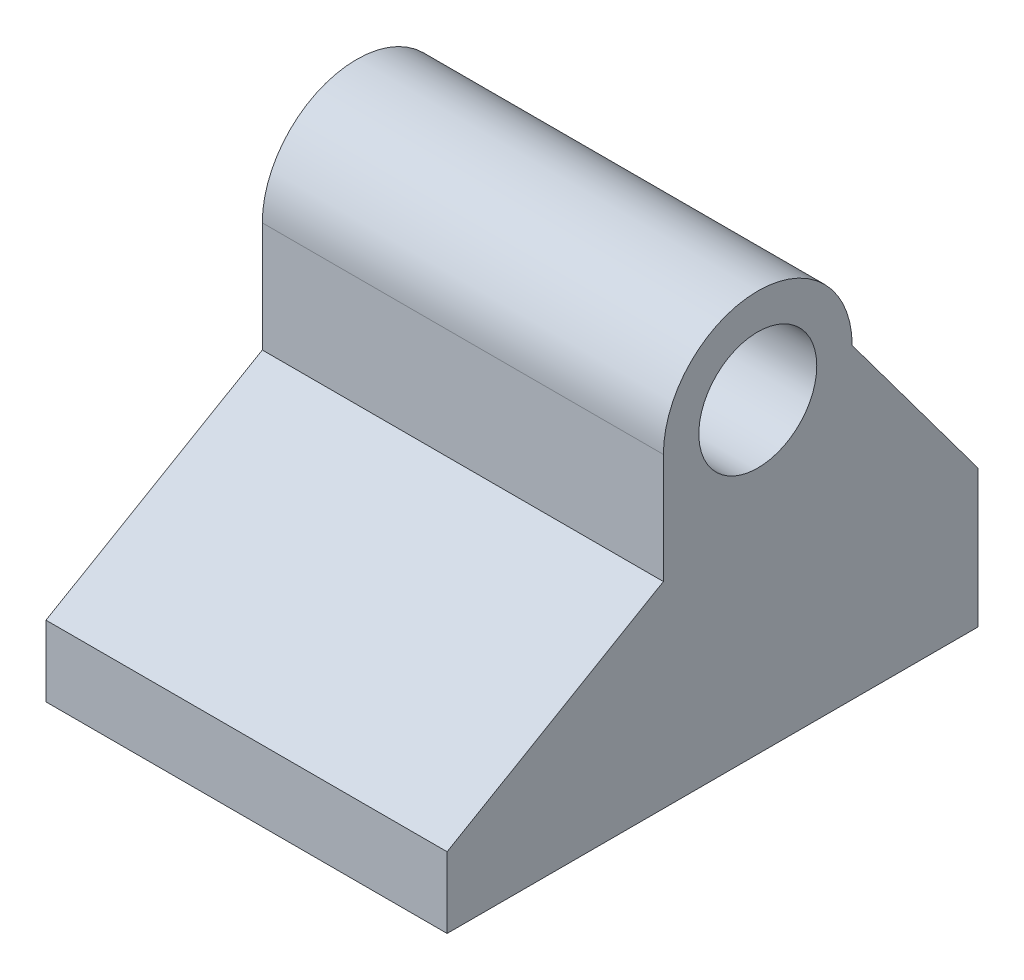
ISO-10303-21;
HEADER;
FILE_DESCRIPTION(('STEP AP214'),'2;1');
FILE_NAME('part.step','',(''),(''),'','','');
FILE_SCHEMA(('AUTOMOTIVE_DESIGN { 1 0 10303 214 1 1 1 1 }'));
ENDSEC;
DATA;
#1=APPLICATION_CONTEXT('core data for automotive mechanical design processes');
#2=APPLICATION_PROTOCOL_DEFINITION('international standard','automotive_design',2000,#1);
#3=PRODUCT_CONTEXT('',#1,'mechanical');
#4=PRODUCT('Part','Part','',(#3));
#5=PRODUCT_RELATED_PRODUCT_CATEGORY('part','',(#4));
#6=PRODUCT_DEFINITION_FORMATION('','',#4);
#7=PRODUCT_DEFINITION_CONTEXT('part definition',#1,'design');
#8=PRODUCT_DEFINITION('design','',#6,#7);
#9=PRODUCT_DEFINITION_SHAPE('','',#8);
#10=(LENGTH_UNIT() NAMED_UNIT(*) SI_UNIT(.MILLI.,.METRE.));
#11=(NAMED_UNIT(*) PLANE_ANGLE_UNIT() SI_UNIT($,.RADIAN.));
#12=(NAMED_UNIT(*) SI_UNIT($,.STERADIAN.) SOLID_ANGLE_UNIT());
#13=UNCERTAINTY_MEASURE_WITH_UNIT(LENGTH_MEASURE(1.E-05),#10,'distance_accuracy_value','');
#14=(GEOMETRIC_REPRESENTATION_CONTEXT(3) GLOBAL_UNCERTAINTY_ASSIGNED_CONTEXT((#13)) GLOBAL_UNIT_ASSIGNED_CONTEXT((#10,
#11,#12)) REPRESENTATION_CONTEXT('',''));
#15=CARTESIAN_POINT('',(0.,0.,0.));
#16=DIRECTION('',(0.,0.,1.));
#17=DIRECTION('',(1.,0.,0.));
#18=AXIS2_PLACEMENT_3D('',#15,#16,#17);
#19=CARTESIAN_POINT('',(102.633192204752,78.,56.));
#20=DIRECTION('',(-1.,0.,0.));
#21=DIRECTION('',(0.,0.,1.));
#22=AXIS2_PLACEMENT_3D('',#19,#20,#21);
#23=PLANE('',#22);
#24=DIRECTION('',(0.,0.,-1.));
#25=VECTOR('',#24,1.);
#26=CARTESIAN_POINT('',(102.633192204752,0.,0.));
#27=LINE('',#26,#25);
#28=CARTESIAN_POINT('',(102.633192204752,0.,135.));
#29=VERTEX_POINT('',#28);
#30=CARTESIAN_POINT('',(102.633192204752,0.,0.));
#31=VERTEX_POINT('',#30);
#32=EDGE_CURVE('E141',#29,#31,#27,.T.);
#33=ORIENTED_EDGE('',*,*,#32,.T.);
#34=DIRECTION('',(0.,1.,0.));
#35=VECTOR('',#34,1.);
#36=CARTESIAN_POINT('',(102.633192204752,0.,0.));
#37=LINE('',#36,#35);
#38=CARTESIAN_POINT('',(102.633192204752,35.,0.));
#39=VERTEX_POINT('',#38);
#40=EDGE_CURVE('E94',#31,#39,#37,.T.);
#41=ORIENTED_EDGE('',*,*,#40,.T.);
#42=DIRECTION('',(0.,0.802233221274024,0.597010769320204));
#43=VECTOR('',#42,1.);
#44=CARTESIAN_POINT('',(102.633192204752,35.,0.));
#45=LINE('',#44,#43);
#46=CARTESIAN_POINT('',(102.633192204752,78.,32.));
#47=VERTEX_POINT('',#46);
#48=EDGE_CURVE('E153',#39,#47,#45,.T.);
#49=ORIENTED_EDGE('',*,*,#48,.T.);
#50=CARTESIAN_POINT('',(102.633192204752,78.,56.));
#51=DIRECTION('',(1.,0.,0.));
#52=DIRECTION('',(0.,0.,1.));
#53=AXIS2_PLACEMENT_3D('',#50,#51,#52);
#54=CIRCLE('',#53,24.);
#55=CARTESIAN_POINT('',(102.633192204752,78.,80.));
#56=VERTEX_POINT('',#55);
#57=EDGE_CURVE('E110',#47,#56,#54,.T.);
#58=ORIENTED_EDGE('',*,*,#57,.T.);
#59=DIRECTION('',(0.,-1.,0.));
#60=VECTOR('',#59,1.);
#61=CARTESIAN_POINT('',(102.633192204752,50.,80.));
#62=LINE('',#61,#60);
#63=CARTESIAN_POINT('',(102.633192204752,50.,80.));
#64=VERTEX_POINT('',#63);
#65=EDGE_CURVE('E104',#56,#64,#62,.T.);
#66=ORIENTED_EDGE('',*,*,#65,.T.);
#67=DIRECTION('',(0.,-0.502893578303638,0.864348337709377));
#68=VECTOR('',#67,1.);
#69=CARTESIAN_POINT('',(102.633192204752,18.,135.));
#70=LINE('',#69,#68);
#71=CARTESIAN_POINT('',(102.633192204752,18.,135.));
#72=VERTEX_POINT('',#71);
#73=EDGE_CURVE('E108',#64,#72,#70,.T.);
#74=ORIENTED_EDGE('',*,*,#73,.T.);
#75=DIRECTION('',(0.,-1.,0.));
#76=VECTOR('',#75,1.);
#77=CARTESIAN_POINT('',(102.633192204752,0.,135.));
#78=LINE('',#77,#76);
#79=EDGE_CURVE('E54',#72,#29,#78,.T.);
#80=ORIENTED_EDGE('',*,*,#79,.T.);
#81=EDGE_LOOP('',(#33,#41,#49,#58,#66,#74,#80));
#82=FACE_BOUND('',#81,.T.);
#83=CARTESIAN_POINT('',(102.633192204752,78.,56.));
#84=DIRECTION('',(1.,0.,0.));
#85=DIRECTION('',(0.,0.,-1.));
#86=AXIS2_PLACEMENT_3D('',#83,#84,#85);
#87=CIRCLE('',#86,15.);
#88=CARTESIAN_POINT('',(102.633192204752,78.,41.));
#89=VERTEX_POINT('',#88);
#90=EDGE_CURVE('E132',#89,#89,#87,.T.);
#91=ORIENTED_EDGE('',*,*,#90,.F.);
#92=EDGE_LOOP('',(#91));
#93=FACE_BOUND('',#92,.T.);
#94=ADVANCED_FACE('F37',(#82,#93),#23,.F.);
#95=CARTESIAN_POINT('',(0.633192204751778,78.,56.));
#96=DIRECTION('',(-1.,0.,0.));
#97=DIRECTION('',(0.,0.,1.));
#98=AXIS2_PLACEMENT_3D('',#95,#96,#97);
#99=PLANE('',#98);
#100=DIRECTION('',(0.,0.,-1.));
#101=VECTOR('',#100,1.);
#102=CARTESIAN_POINT('',(0.633192204751778,0.,0.));
#103=LINE('',#102,#101);
#104=CARTESIAN_POINT('',(0.633192204751778,0.,135.));
#105=VERTEX_POINT('',#104);
#106=CARTESIAN_POINT('',(0.633192204751778,0.,0.));
#107=VERTEX_POINT('',#106);
#108=EDGE_CURVE('E128',#105,#107,#103,.T.);
#109=ORIENTED_EDGE('',*,*,#108,.F.);
#110=DIRECTION('',(0.,-1.,0.));
#111=VECTOR('',#110,1.);
#112=CARTESIAN_POINT('',(0.633192204751778,0.,135.));
#113=LINE('',#112,#111);
#114=CARTESIAN_POINT('',(0.633192204751778,18.,135.));
#115=VERTEX_POINT('',#114);
#116=EDGE_CURVE('E86',#115,#105,#113,.T.);
#117=ORIENTED_EDGE('',*,*,#116,.F.);
#118=DIRECTION('',(0.,-0.502893578303638,0.864348337709377));
#119=VECTOR('',#118,1.);
#120=CARTESIAN_POINT('',(0.633192204751778,18.,135.));
#121=LINE('',#120,#119);
#122=CARTESIAN_POINT('',(0.633192204751778,50.,80.));
#123=VERTEX_POINT('',#122);
#124=EDGE_CURVE('E80',#123,#115,#121,.T.);
#125=ORIENTED_EDGE('',*,*,#124,.F.);
#126=DIRECTION('',(0.,-1.,0.));
#127=VECTOR('',#126,1.);
#128=CARTESIAN_POINT('',(0.633192204751778,50.,80.));
#129=LINE('',#128,#127);
#130=CARTESIAN_POINT('',(0.633192204751778,78.,80.));
#131=VERTEX_POINT('',#130);
#132=EDGE_CURVE('E118',#131,#123,#129,.T.);
#133=ORIENTED_EDGE('',*,*,#132,.F.);
#134=CARTESIAN_POINT('',(0.633192204751778,78.,56.));
#135=DIRECTION('',(1.,0.,0.));
#136=DIRECTION('',(0.,0.,1.));
#137=AXIS2_PLACEMENT_3D('',#134,#135,#136);
#138=CIRCLE('',#137,24.);
#139=CARTESIAN_POINT('',(0.633192204751778,78.,32.));
#140=VERTEX_POINT('',#139);
#141=EDGE_CURVE('E136',#140,#131,#138,.T.);
#142=ORIENTED_EDGE('',*,*,#141,.F.);
#143=DIRECTION('',(0.,0.802233221274024,0.597010769320204));
#144=VECTOR('',#143,1.);
#145=CARTESIAN_POINT('',(0.633192204751778,35.,0.));
#146=LINE('',#145,#144);
#147=CARTESIAN_POINT('',(0.633192204751778,35.,0.));
#148=VERTEX_POINT('',#147);
#149=EDGE_CURVE('E134',#148,#140,#146,.T.);
#150=ORIENTED_EDGE('',*,*,#149,.F.);
#151=DIRECTION('',(0.,1.,0.));
#152=VECTOR('',#151,1.);
#153=CARTESIAN_POINT('',(0.633192204751778,0.,0.));
#154=LINE('',#153,#152);
#155=EDGE_CURVE('E131',#107,#148,#154,.T.);
#156=ORIENTED_EDGE('',*,*,#155,.F.);
#157=EDGE_LOOP('',(#109,#117,#125,#133,#142,#150,#156));
#158=FACE_BOUND('',#157,.T.);
#159=CARTESIAN_POINT('',(0.633192204751778,78.,56.));
#160=DIRECTION('',(1.,0.,0.));
#161=DIRECTION('',(0.,0.,-1.));
#162=AXIS2_PLACEMENT_3D('',#159,#160,#161);
#163=CIRCLE('',#162,15.);
#164=CARTESIAN_POINT('',(0.633192204751778,78.,41.));
#165=VERTEX_POINT('',#164);
#166=EDGE_CURVE('E165',#165,#165,#163,.T.);
#167=ORIENTED_EDGE('',*,*,#166,.T.);
#168=EDGE_LOOP('',(#167));
#169=FACE_BOUND('',#168,.T.);
#170=ADVANCED_FACE('F157',(#158,#169),#99,.T.);
#171=CARTESIAN_POINT('',(102.633192204752,0.,0.));
#172=DIRECTION('',(0.,1.,0.));
#173=DIRECTION('',(0.,0.,1.));
#174=AXIS2_PLACEMENT_3D('',#171,#172,#173);
#175=PLANE('',#174);
#176=ORIENTED_EDGE('',*,*,#108,.T.);
#177=DIRECTION('',(-1.,0.,0.));
#178=VECTOR('',#177,1.);
#179=CARTESIAN_POINT('',(102.633192204752,0.,0.));
#180=LINE('',#179,#178);
#181=EDGE_CURVE('E11',#31,#107,#180,.T.);
#182=ORIENTED_EDGE('',*,*,#181,.F.);
#183=ORIENTED_EDGE('',*,*,#32,.F.);
#184=DIRECTION('',(-1.,0.,0.));
#185=VECTOR('',#184,1.);
#186=CARTESIAN_POINT('',(102.633192204752,0.,135.));
#187=LINE('',#186,#185);
#188=EDGE_CURVE('E124',#29,#105,#187,.T.);
#189=ORIENTED_EDGE('',*,*,#188,.T.);
#190=EDGE_LOOP('',(#176,#182,#183,#189));
#191=FACE_BOUND('',#190,.T.);
#192=ADVANCED_FACE('F39',(#191),#175,.F.);
#193=CARTESIAN_POINT('',(102.633192204752,0.,0.));
#194=DIRECTION('',(0.,0.,1.));
#195=DIRECTION('',(1.,0.,0.));
#196=AXIS2_PLACEMENT_3D('',#193,#194,#195);
#197=PLANE('',#196);
#198=ORIENTED_EDGE('',*,*,#155,.T.);
#199=DIRECTION('',(-1.,0.,0.));
#200=VECTOR('',#199,1.);
#201=CARTESIAN_POINT('',(102.633192204752,35.,0.));
#202=LINE('',#201,#200);
#203=EDGE_CURVE('E46',#39,#148,#202,.T.);
#204=ORIENTED_EDGE('',*,*,#203,.F.);
#205=ORIENTED_EDGE('',*,*,#40,.F.);
#206=ORIENTED_EDGE('',*,*,#181,.T.);
#207=EDGE_LOOP('',(#198,#204,#205,#206));
#208=FACE_BOUND('',#207,.T.);
#209=ADVANCED_FACE('F191',(#208),#197,.F.);
#210=CARTESIAN_POINT('',(102.633192204752,35.,0.));
#211=DIRECTION('',(0.,-0.597010769320205,0.802233221274024));
#212=DIRECTION('',(0.,-0.802233221274024,-0.597010769320205));
#213=AXIS2_PLACEMENT_3D('',#210,#211,#212);
#214=PLANE('',#213);
#215=ORIENTED_EDGE('',*,*,#149,.T.);
#216=DIRECTION('',(-1.,0.,0.));
#217=VECTOR('',#216,1.);
#218=CARTESIAN_POINT('',(102.633192204752,78.,32.));
#219=LINE('',#218,#217);
#220=EDGE_CURVE('E145',#47,#140,#219,.T.);
#221=ORIENTED_EDGE('',*,*,#220,.F.);
#222=ORIENTED_EDGE('',*,*,#48,.F.);
#223=ORIENTED_EDGE('',*,*,#203,.T.);
#224=EDGE_LOOP('',(#215,#221,#222,#223));
#225=FACE_BOUND('',#224,.T.);
#226=ADVANCED_FACE('F151',(#225),#214,.F.);
#227=CARTESIAN_POINT('',(102.633192204752,78.,56.));
#228=DIRECTION('',(-1.,0.,0.));
#229=DIRECTION('',(0.,0.,1.));
#230=AXIS2_PLACEMENT_3D('',#227,#228,#229);
#231=CYLINDRICAL_SURFACE('',#230,24.);
#232=ORIENTED_EDGE('',*,*,#141,.T.);
#233=DIRECTION('',(-1.,0.,0.));
#234=VECTOR('',#233,1.);
#235=CARTESIAN_POINT('',(102.633192204752,78.,80.));
#236=LINE('',#235,#234);
#237=EDGE_CURVE('E119',#56,#131,#236,.T.);
#238=ORIENTED_EDGE('',*,*,#237,.F.);
#239=ORIENTED_EDGE('',*,*,#57,.F.);
#240=ORIENTED_EDGE('',*,*,#220,.T.);
#241=EDGE_LOOP('',(#232,#238,#239,#240));
#242=FACE_BOUND('',#241,.T.);
#243=ADVANCED_FACE('F160',(#242),#231,.T.);
#244=CARTESIAN_POINT('',(102.633192204752,50.,80.));
#245=DIRECTION('',(0.,0.,-1.));
#246=DIRECTION('',(-1.,0.,0.));
#247=AXIS2_PLACEMENT_3D('',#244,#245,#246);
#248=PLANE('',#247);
#249=ORIENTED_EDGE('',*,*,#132,.T.);
#250=DIRECTION('',(-1.,0.,0.));
#251=VECTOR('',#250,1.);
#252=CARTESIAN_POINT('',(102.633192204752,50.,80.));
#253=LINE('',#252,#251);
#254=EDGE_CURVE('E115',#64,#123,#253,.T.);
#255=ORIENTED_EDGE('',*,*,#254,.F.);
#256=ORIENTED_EDGE('',*,*,#65,.F.);
#257=ORIENTED_EDGE('',*,*,#237,.T.);
#258=EDGE_LOOP('',(#249,#255,#256,#257));
#259=FACE_BOUND('',#258,.T.);
#260=ADVANCED_FACE('F116',(#259),#248,.F.);
#261=CARTESIAN_POINT('',(102.633192204752,18.,135.));
#262=DIRECTION('',(0.,-0.864348337709377,-0.502893578303638));
#263=DIRECTION('',(0.,0.502893578303638,-0.864348337709377));
#264=AXIS2_PLACEMENT_3D('',#261,#262,#263);
#265=PLANE('',#264);
#266=ORIENTED_EDGE('',*,*,#124,.T.);
#267=DIRECTION('',(-1.,0.,0.));
#268=VECTOR('',#267,1.);
#269=CARTESIAN_POINT('',(102.633192204752,18.,135.));
#270=LINE('',#269,#268);
#271=EDGE_CURVE('E120',#72,#115,#270,.T.);
#272=ORIENTED_EDGE('',*,*,#271,.F.);
#273=ORIENTED_EDGE('',*,*,#73,.F.);
#274=ORIENTED_EDGE('',*,*,#254,.T.);
#275=EDGE_LOOP('',(#266,#272,#273,#274));
#276=FACE_BOUND('',#275,.T.);
#277=ADVANCED_FACE('F122',(#276),#265,.F.);
#278=CARTESIAN_POINT('',(102.633192204752,0.,135.));
#279=DIRECTION('',(0.,0.,-1.));
#280=DIRECTION('',(-1.,0.,0.));
#281=AXIS2_PLACEMENT_3D('',#278,#279,#280);
#282=PLANE('',#281);
#283=ORIENTED_EDGE('',*,*,#116,.T.);
#284=ORIENTED_EDGE('',*,*,#188,.F.);
#285=ORIENTED_EDGE('',*,*,#79,.F.);
#286=ORIENTED_EDGE('',*,*,#271,.T.);
#287=EDGE_LOOP('',(#283,#284,#285,#286));
#288=FACE_BOUND('',#287,.T.);
#289=ADVANCED_FACE('F181',(#288),#282,.F.);
#290=CARTESIAN_POINT('',(102.633192204752,78.,56.));
#291=DIRECTION('',(-1.,0.,0.));
#292=DIRECTION('',(0.,0.,1.));
#293=AXIS2_PLACEMENT_3D('',#290,#291,#292);
#294=CYLINDRICAL_SURFACE('',#293,15.);
#295=ORIENTED_EDGE('',*,*,#90,.T.);
#296=EDGE_LOOP('',(#295));
#297=FACE_BOUND('',#296,.T.);
#298=ORIENTED_EDGE('',*,*,#166,.F.);
#299=EDGE_LOOP('',(#298));
#300=FACE_BOUND('',#299,.T.);
#301=ADVANCED_FACE('F171',(#297,#300),#294,.F.);
#302=CLOSED_SHELL('',(#94,#170,#192,#209,#226,#243,#260,#277,#289,#301));
#303=MANIFOLD_SOLID_BREP('B2',#302);
#304=ADVANCED_BREP_SHAPE_REPRESENTATION('',(#18,#303),#14);
#305=SHAPE_DEFINITION_REPRESENTATION(#9,#304);
ENDSEC;
END-ISO-10303-21;
